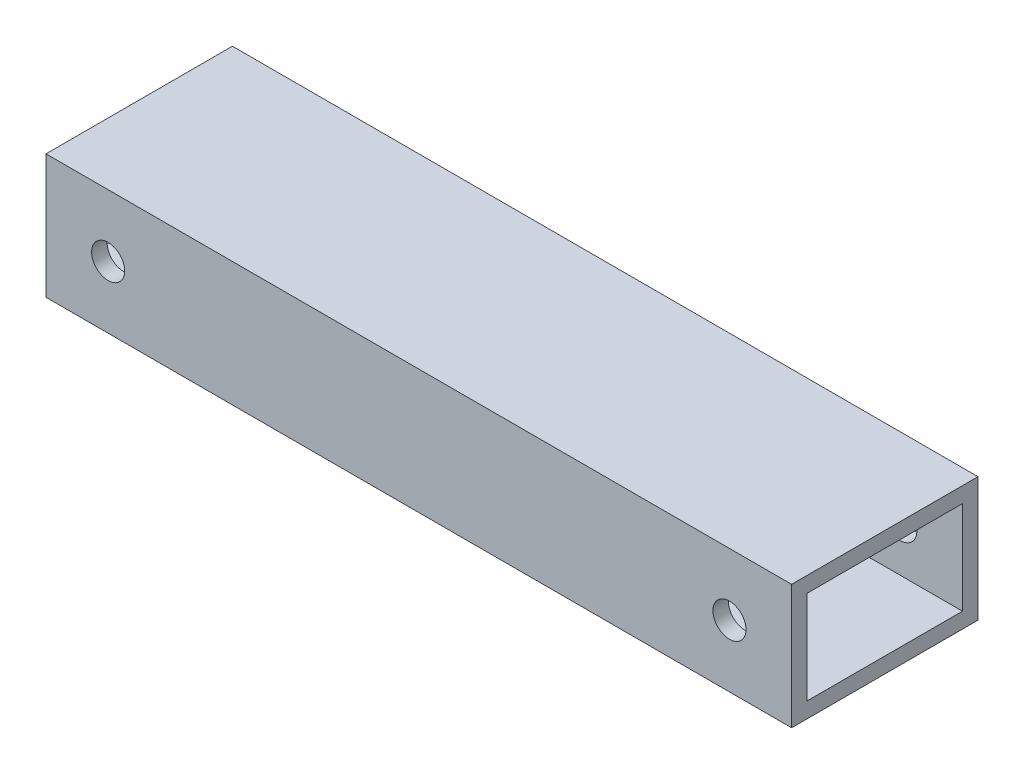
ISO-10303-21;
HEADER;
FILE_DESCRIPTION(('STEP AP214'),'2;1');
FILE_NAME('part.step','',(''),(''),'','','');
FILE_SCHEMA(('AUTOMOTIVE_DESIGN { 1 0 10303 214 1 1 1 1 }'));
ENDSEC;
DATA;
#1=APPLICATION_CONTEXT('core data for automotive mechanical design processes');
#2=APPLICATION_PROTOCOL_DEFINITION('international standard','automotive_design',2000,#1);
#3=PRODUCT_CONTEXT('',#1,'mechanical');
#4=PRODUCT('Part','Part','',(#3));
#5=PRODUCT_RELATED_PRODUCT_CATEGORY('part','',(#4));
#6=PRODUCT_DEFINITION_FORMATION('','',#4);
#7=PRODUCT_DEFINITION_CONTEXT('part definition',#1,'design');
#8=PRODUCT_DEFINITION('design','',#6,#7);
#9=PRODUCT_DEFINITION_SHAPE('','',#8);
#10=(LENGTH_UNIT() NAMED_UNIT(*) SI_UNIT(.MILLI.,.METRE.));
#11=(NAMED_UNIT(*) PLANE_ANGLE_UNIT() SI_UNIT($,.RADIAN.));
#12=(NAMED_UNIT(*) SI_UNIT($,.STERADIAN.) SOLID_ANGLE_UNIT());
#13=UNCERTAINTY_MEASURE_WITH_UNIT(LENGTH_MEASURE(1.E-05),#10,'distance_accuracy_value','');
#14=(GEOMETRIC_REPRESENTATION_CONTEXT(3) GLOBAL_UNCERTAINTY_ASSIGNED_CONTEXT((#13)) GLOBAL_UNIT_ASSIGNED_CONTEXT((#10,
#11,#12)) REPRESENTATION_CONTEXT('',''));
#15=CARTESIAN_POINT('',(0.,0.,0.));
#16=DIRECTION('',(0.,0.,1.));
#17=DIRECTION('',(1.,0.,0.));
#18=AXIS2_PLACEMENT_3D('',#15,#16,#17);
#19=CARTESIAN_POINT('',(152.4,0.,0.));
#20=DIRECTION('',(1.,0.,0.));
#21=DIRECTION('',(0.,0.,-1.));
#22=AXIS2_PLACEMENT_3D('',#19,#20,#21);
#23=PLANE('',#22);
#24=DIRECTION('',(0.,-1.,0.));
#25=VECTOR('',#24,1.);
#26=CARTESIAN_POINT('',(152.4,0.,0.));
#27=LINE('',#26,#25);
#28=CARTESIAN_POINT('',(152.4,25.4,0.));
#29=VERTEX_POINT('',#28);
#30=CARTESIAN_POINT('',(152.4,0.,0.));
#31=VERTEX_POINT('',#30);
#32=EDGE_CURVE('E162',#29,#31,#27,.T.);
#33=ORIENTED_EDGE('',*,*,#32,.T.);
#34=DIRECTION('',(0.,0.,-1.));
#35=VECTOR('',#34,1.);
#36=CARTESIAN_POINT('',(152.4,0.,0.));
#37=LINE('',#36,#35);
#38=CARTESIAN_POINT('',(152.4,0.,-38.1));
#39=VERTEX_POINT('',#38);
#40=EDGE_CURVE('E165',#31,#39,#37,.T.);
#41=ORIENTED_EDGE('',*,*,#40,.T.);
#42=DIRECTION('',(0.,1.,0.));
#43=VECTOR('',#42,1.);
#44=CARTESIAN_POINT('',(152.4,0.,-38.1));
#45=LINE('',#44,#43);
#46=CARTESIAN_POINT('',(152.4,25.4,-38.1));
#47=VERTEX_POINT('',#46);
#48=EDGE_CURVE('E168',#39,#47,#45,.T.);
#49=ORIENTED_EDGE('',*,*,#48,.T.);
#50=DIRECTION('',(0.,0.,1.));
#51=VECTOR('',#50,1.);
#52=CARTESIAN_POINT('',(152.4,25.4,0.));
#53=LINE('',#52,#51);
#54=EDGE_CURVE('E170',#47,#29,#53,.T.);
#55=ORIENTED_EDGE('',*,*,#54,.T.);
#56=EDGE_LOOP('',(#33,#41,#49,#55));
#57=FACE_BOUND('',#56,.T.);
#58=DIRECTION('',(0.,0.,-1.));
#59=VECTOR('',#58,1.);
#60=CARTESIAN_POINT('',(152.4,3.175,0.));
#61=LINE('',#60,#59);
#62=CARTESIAN_POINT('',(152.4,3.175,-3.175));
#63=VERTEX_POINT('',#62);
#64=CARTESIAN_POINT('',(152.4,3.175,-34.925));
#65=VERTEX_POINT('',#64);
#66=EDGE_CURVE('E132',#63,#65,#61,.T.);
#67=ORIENTED_EDGE('',*,*,#66,.F.);
#68=DIRECTION('',(0.,-1.,0.));
#69=VECTOR('',#68,1.);
#70=CARTESIAN_POINT('',(152.4,0.,-3.175));
#71=LINE('',#70,#69);
#72=CARTESIAN_POINT('',(152.4,22.225,-3.175));
#73=VERTEX_POINT('',#72);
#74=EDGE_CURVE('E124',#73,#63,#71,.T.);
#75=ORIENTED_EDGE('',*,*,#74,.F.);
#76=DIRECTION('',(0.,0.,1.));
#77=VECTOR('',#76,1.);
#78=CARTESIAN_POINT('',(152.4,22.225,0.));
#79=LINE('',#78,#77);
#80=CARTESIAN_POINT('',(152.4,22.225,-34.925));
#81=VERTEX_POINT('',#80);
#82=EDGE_CURVE('E146',#81,#73,#79,.T.);
#83=ORIENTED_EDGE('',*,*,#82,.F.);
#84=DIRECTION('',(0.,1.,0.));
#85=VECTOR('',#84,1.);
#86=CARTESIAN_POINT('',(152.4,0.,-34.925));
#87=LINE('',#86,#85);
#88=EDGE_CURVE('E144',#65,#81,#87,.T.);
#89=ORIENTED_EDGE('',*,*,#88,.F.);
#90=EDGE_LOOP('',(#67,#75,#83,#89));
#91=FACE_BOUND('',#90,.T.);
#92=ADVANCED_FACE('F57',(#57,#91),#23,.T.);
#93=CARTESIAN_POINT('',(0.,0.,0.));
#94=DIRECTION('',(1.,0.,0.));
#95=DIRECTION('',(0.,0.,-1.));
#96=AXIS2_PLACEMENT_3D('',#93,#94,#95);
#97=PLANE('',#96);
#98=DIRECTION('',(0.,-1.,0.));
#99=VECTOR('',#98,1.);
#100=CARTESIAN_POINT('',(0.,0.,0.));
#101=LINE('',#100,#99);
#102=CARTESIAN_POINT('',(0.,25.4,0.));
#103=VERTEX_POINT('',#102);
#104=CARTESIAN_POINT('',(0.,0.,0.));
#105=VERTEX_POINT('',#104);
#106=EDGE_CURVE('E140',#103,#105,#101,.T.);
#107=ORIENTED_EDGE('',*,*,#106,.F.);
#108=DIRECTION('',(0.,0.,1.));
#109=VECTOR('',#108,1.);
#110=CARTESIAN_POINT('',(0.,25.4,0.));
#111=LINE('',#110,#109);
#112=CARTESIAN_POINT('',(0.,25.4,-38.1));
#113=VERTEX_POINT('',#112);
#114=EDGE_CURVE('E166',#113,#103,#111,.T.);
#115=ORIENTED_EDGE('',*,*,#114,.F.);
#116=DIRECTION('',(0.,1.,0.));
#117=VECTOR('',#116,1.);
#118=CARTESIAN_POINT('',(0.,0.,-38.1));
#119=LINE('',#118,#117);
#120=CARTESIAN_POINT('',(0.,0.,-38.1));
#121=VERTEX_POINT('',#120);
#122=EDGE_CURVE('E177',#121,#113,#119,.T.);
#123=ORIENTED_EDGE('',*,*,#122,.F.);
#124=DIRECTION('',(0.,0.,-1.));
#125=VECTOR('',#124,1.);
#126=CARTESIAN_POINT('',(0.,0.,0.));
#127=LINE('',#126,#125);
#128=EDGE_CURVE('E175',#105,#121,#127,.T.);
#129=ORIENTED_EDGE('',*,*,#128,.F.);
#130=EDGE_LOOP('',(#107,#115,#123,#129));
#131=FACE_BOUND('',#130,.T.);
#132=DIRECTION('',(0.,-1.,0.));
#133=VECTOR('',#132,1.);
#134=CARTESIAN_POINT('',(0.,0.,-3.175));
#135=LINE('',#134,#133);
#136=CARTESIAN_POINT('',(0.,22.225,-3.175));
#137=VERTEX_POINT('',#136);
#138=CARTESIAN_POINT('',(0.,3.175,-3.175));
#139=VERTEX_POINT('',#138);
#140=EDGE_CURVE('E82',#137,#139,#135,.T.);
#141=ORIENTED_EDGE('',*,*,#140,.T.);
#142=DIRECTION('',(0.,0.,-1.));
#143=VECTOR('',#142,1.);
#144=CARTESIAN_POINT('',(0.,3.175,0.));
#145=LINE('',#144,#143);
#146=CARTESIAN_POINT('',(0.,3.175,-34.925));
#147=VERTEX_POINT('',#146);
#148=EDGE_CURVE('E139',#139,#147,#145,.T.);
#149=ORIENTED_EDGE('',*,*,#148,.T.);
#150=DIRECTION('',(0.,1.,0.));
#151=VECTOR('',#150,1.);
#152=CARTESIAN_POINT('',(0.,0.,-34.925));
#153=LINE('',#152,#151);
#154=CARTESIAN_POINT('',(0.,22.225,-34.925));
#155=VERTEX_POINT('',#154);
#156=EDGE_CURVE('E154',#147,#155,#153,.T.);
#157=ORIENTED_EDGE('',*,*,#156,.T.);
#158=DIRECTION('',(0.,0.,1.));
#159=VECTOR('',#158,1.);
#160=CARTESIAN_POINT('',(0.,22.225,0.));
#161=LINE('',#160,#159);
#162=EDGE_CURVE('E133',#155,#137,#161,.T.);
#163=ORIENTED_EDGE('',*,*,#162,.T.);
#164=EDGE_LOOP('',(#141,#149,#157,#163));
#165=FACE_BOUND('',#164,.T.);
#166=ADVANCED_FACE('F224',(#131,#165),#97,.F.);
#167=CARTESIAN_POINT('',(152.4,0.,0.));
#168=DIRECTION('',(0.,0.,-1.));
#169=DIRECTION('',(-1.,0.,0.));
#170=AXIS2_PLACEMENT_3D('',#167,#168,#169);
#171=PLANE('',#170);
#172=CARTESIAN_POINT('',(139.7,12.7,0.));
#173=DIRECTION('',(0.,0.,1.));
#174=DIRECTION('',(1.,0.,0.));
#175=AXIS2_PLACEMENT_3D('',#172,#173,#174);
#176=CIRCLE('',#175,3.37819999999999);
#177=CARTESIAN_POINT('',(143.0782,12.7,0.));
#178=VERTEX_POINT('',#177);
#179=EDGE_CURVE('E203',#178,#178,#176,.T.);
#180=ORIENTED_EDGE('',*,*,#179,.F.);
#181=EDGE_LOOP('',(#180));
#182=FACE_BOUND('',#181,.T.);
#183=CARTESIAN_POINT('',(12.7,12.7,0.));
#184=DIRECTION('',(0.,0.,1.));
#185=DIRECTION('',(1.,0.,0.));
#186=AXIS2_PLACEMENT_3D('',#183,#184,#185);
#187=CIRCLE('',#186,3.37819999999999);
#188=CARTESIAN_POINT('',(16.0782,12.7,0.));
#189=VERTEX_POINT('',#188);
#190=EDGE_CURVE('E193',#189,#189,#187,.T.);
#191=ORIENTED_EDGE('',*,*,#190,.F.);
#192=EDGE_LOOP('',(#191));
#193=FACE_BOUND('',#192,.T.);
#194=ORIENTED_EDGE('',*,*,#106,.T.);
#195=DIRECTION('',(-1.,0.,0.));
#196=VECTOR('',#195,1.);
#197=CARTESIAN_POINT('',(152.4,0.,0.));
#198=LINE('',#197,#196);
#199=EDGE_CURVE('E12',#31,#105,#198,.T.);
#200=ORIENTED_EDGE('',*,*,#199,.F.);
#201=ORIENTED_EDGE('',*,*,#32,.F.);
#202=DIRECTION('',(-1.,0.,0.));
#203=VECTOR('',#202,1.);
#204=CARTESIAN_POINT('',(152.4,25.4,0.));
#205=LINE('',#204,#203);
#206=EDGE_CURVE('E172',#29,#103,#205,.T.);
#207=ORIENTED_EDGE('',*,*,#206,.T.);
#208=EDGE_LOOP('',(#194,#200,#201,#207));
#209=FACE_BOUND('',#208,.T.);
#210=ADVANCED_FACE('F59',(#182,#193,#209),#171,.F.);
#211=CARTESIAN_POINT('',(152.4,0.,0.));
#212=DIRECTION('',(0.,1.,0.));
#213=DIRECTION('',(0.,0.,1.));
#214=AXIS2_PLACEMENT_3D('',#211,#212,#213);
#215=PLANE('',#214);
#216=ORIENTED_EDGE('',*,*,#128,.T.);
#217=DIRECTION('',(-1.,0.,0.));
#218=VECTOR('',#217,1.);
#219=CARTESIAN_POINT('',(152.4,0.,-38.1));
#220=LINE('',#219,#218);
#221=EDGE_CURVE('E66',#39,#121,#220,.T.);
#222=ORIENTED_EDGE('',*,*,#221,.F.);
#223=ORIENTED_EDGE('',*,*,#40,.F.);
#224=ORIENTED_EDGE('',*,*,#199,.T.);
#225=EDGE_LOOP('',(#216,#222,#223,#224));
#226=FACE_BOUND('',#225,.T.);
#227=ADVANCED_FACE('F250',(#226),#215,.F.);
#228=CARTESIAN_POINT('',(152.4,0.,-38.1));
#229=DIRECTION('',(0.,0.,1.));
#230=DIRECTION('',(1.,0.,0.));
#231=AXIS2_PLACEMENT_3D('',#228,#229,#230);
#232=PLANE('',#231);
#233=CARTESIAN_POINT('',(139.7,12.7,-38.1));
#234=DIRECTION('',(0.,0.,1.));
#235=DIRECTION('',(1.,0.,0.));
#236=AXIS2_PLACEMENT_3D('',#233,#234,#235);
#237=CIRCLE('',#236,3.37819999999999);
#238=CARTESIAN_POINT('',(143.0782,12.7,-38.1));
#239=VERTEX_POINT('',#238);
#240=EDGE_CURVE('E206',#239,#239,#237,.T.);
#241=ORIENTED_EDGE('',*,*,#240,.T.);
#242=EDGE_LOOP('',(#241));
#243=FACE_BOUND('',#242,.T.);
#244=CARTESIAN_POINT('',(12.7,12.7,-38.1));
#245=DIRECTION('',(0.,0.,1.));
#246=DIRECTION('',(1.,0.,0.));
#247=AXIS2_PLACEMENT_3D('',#244,#245,#246);
#248=CIRCLE('',#247,3.37819999999999);
#249=CARTESIAN_POINT('',(16.0782,12.7,-38.1));
#250=VERTEX_POINT('',#249);
#251=EDGE_CURVE('E188',#250,#250,#248,.T.);
#252=ORIENTED_EDGE('',*,*,#251,.T.);
#253=EDGE_LOOP('',(#252));
#254=FACE_BOUND('',#253,.T.);
#255=ORIENTED_EDGE('',*,*,#122,.T.);
#256=DIRECTION('',(-1.,0.,0.));
#257=VECTOR('',#256,1.);
#258=CARTESIAN_POINT('',(152.4,25.4,-38.1));
#259=LINE('',#258,#257);
#260=EDGE_CURVE('E182',#47,#113,#259,.T.);
#261=ORIENTED_EDGE('',*,*,#260,.F.);
#262=ORIENTED_EDGE('',*,*,#48,.F.);
#263=ORIENTED_EDGE('',*,*,#221,.T.);
#264=EDGE_LOOP('',(#255,#261,#262,#263));
#265=FACE_BOUND('',#264,.T.);
#266=ADVANCED_FACE('F247',(#243,#254,#265),#232,.F.);
#267=CARTESIAN_POINT('',(152.4,25.4,0.));
#268=DIRECTION('',(0.,-1.,0.));
#269=DIRECTION('',(0.,0.,-1.));
#270=AXIS2_PLACEMENT_3D('',#267,#268,#269);
#271=PLANE('',#270);
#272=ORIENTED_EDGE('',*,*,#114,.T.);
#273=ORIENTED_EDGE('',*,*,#206,.F.);
#274=ORIENTED_EDGE('',*,*,#54,.F.);
#275=ORIENTED_EDGE('',*,*,#260,.T.);
#276=EDGE_LOOP('',(#272,#273,#274,#275));
#277=FACE_BOUND('',#276,.T.);
#278=ADVANCED_FACE('F244',(#277),#271,.F.);
#279=CARTESIAN_POINT('',(152.4,0.,-3.175));
#280=DIRECTION('',(0.,0.,-1.));
#281=DIRECTION('',(-1.,0.,0.));
#282=AXIS2_PLACEMENT_3D('',#279,#280,#281);
#283=PLANE('',#282);
#284=CARTESIAN_POINT('',(139.7,12.7,-3.175));
#285=DIRECTION('',(0.,0.,-1.));
#286=DIRECTION('',(-1.,0.,0.));
#287=AXIS2_PLACEMENT_3D('',#284,#285,#286);
#288=CIRCLE('',#287,3.37819999999999);
#289=CARTESIAN_POINT('',(143.0782,12.7,-3.175));
#290=VERTEX_POINT('',#289);
#291=EDGE_CURVE('E198',#290,#290,#288,.T.);
#292=ORIENTED_EDGE('',*,*,#291,.F.);
#293=EDGE_LOOP('',(#292));
#294=FACE_BOUND('',#293,.T.);
#295=CARTESIAN_POINT('',(12.7,12.7,-3.175));
#296=DIRECTION('',(0.,0.,-1.));
#297=DIRECTION('',(-1.,0.,0.));
#298=AXIS2_PLACEMENT_3D('',#295,#296,#297);
#299=CIRCLE('',#298,3.37819999999999);
#300=CARTESIAN_POINT('',(16.0782,12.7,-3.175));
#301=VERTEX_POINT('',#300);
#302=EDGE_CURVE('E152',#301,#301,#299,.T.);
#303=ORIENTED_EDGE('',*,*,#302,.F.);
#304=EDGE_LOOP('',(#303));
#305=FACE_BOUND('',#304,.T.);
#306=ORIENTED_EDGE('',*,*,#140,.F.);
#307=DIRECTION('',(-1.,0.,0.));
#308=VECTOR('',#307,1.);
#309=CARTESIAN_POINT('',(152.4,22.225,-3.175));
#310=LINE('',#309,#308);
#311=EDGE_CURVE('E128',#73,#137,#310,.T.);
#312=ORIENTED_EDGE('',*,*,#311,.F.);
#313=ORIENTED_EDGE('',*,*,#74,.T.);
#314=DIRECTION('',(-1.,0.,0.));
#315=VECTOR('',#314,1.);
#316=CARTESIAN_POINT('',(152.4,3.175,-3.175));
#317=LINE('',#316,#315);
#318=EDGE_CURVE('E127',#63,#139,#317,.T.);
#319=ORIENTED_EDGE('',*,*,#318,.T.);
#320=EDGE_LOOP('',(#306,#312,#313,#319));
#321=FACE_BOUND('',#320,.T.);
#322=ADVANCED_FACE('F126',(#294,#305,#321),#283,.T.);
#323=CARTESIAN_POINT('',(152.4,3.175,0.));
#324=DIRECTION('',(0.,1.,0.));
#325=DIRECTION('',(0.,0.,1.));
#326=AXIS2_PLACEMENT_3D('',#323,#324,#325);
#327=PLANE('',#326);
#328=ORIENTED_EDGE('',*,*,#148,.F.);
#329=ORIENTED_EDGE('',*,*,#318,.F.);
#330=ORIENTED_EDGE('',*,*,#66,.T.);
#331=DIRECTION('',(-1.,0.,0.));
#332=VECTOR('',#331,1.);
#333=CARTESIAN_POINT('',(152.4,3.175,-34.925));
#334=LINE('',#333,#332);
#335=EDGE_CURVE('E141',#65,#147,#334,.T.);
#336=ORIENTED_EDGE('',*,*,#335,.T.);
#337=EDGE_LOOP('',(#328,#329,#330,#336));
#338=FACE_BOUND('',#337,.T.);
#339=ADVANCED_FACE('F136',(#338),#327,.T.);
#340=CARTESIAN_POINT('',(152.4,0.,-34.925));
#341=DIRECTION('',(0.,0.,1.));
#342=DIRECTION('',(1.,0.,0.));
#343=AXIS2_PLACEMENT_3D('',#340,#341,#342);
#344=PLANE('',#343);
#345=CARTESIAN_POINT('',(139.7,12.7,-34.925));
#346=DIRECTION('',(0.,0.,1.));
#347=DIRECTION('',(1.,0.,0.));
#348=AXIS2_PLACEMENT_3D('',#345,#346,#347);
#349=CIRCLE('',#348,3.37819999999999);
#350=CARTESIAN_POINT('',(143.0782,12.7,-34.925));
#351=VERTEX_POINT('',#350);
#352=EDGE_CURVE('E61',#351,#351,#349,.T.);
#353=ORIENTED_EDGE('',*,*,#352,.F.);
#354=EDGE_LOOP('',(#353));
#355=FACE_BOUND('',#354,.T.);
#356=CARTESIAN_POINT('',(12.7,12.7,-34.925));
#357=DIRECTION('',(0.,0.,1.));
#358=DIRECTION('',(1.,0.,0.));
#359=AXIS2_PLACEMENT_3D('',#356,#357,#358);
#360=CIRCLE('',#359,3.37819999999999);
#361=CARTESIAN_POINT('',(16.0782,12.7,-34.925));
#362=VERTEX_POINT('',#361);
#363=EDGE_CURVE('E186',#362,#362,#360,.T.);
#364=ORIENTED_EDGE('',*,*,#363,.F.);
#365=EDGE_LOOP('',(#364));
#366=FACE_BOUND('',#365,.T.);
#367=ORIENTED_EDGE('',*,*,#156,.F.);
#368=ORIENTED_EDGE('',*,*,#335,.F.);
#369=ORIENTED_EDGE('',*,*,#88,.T.);
#370=DIRECTION('',(-1.,0.,0.));
#371=VECTOR('',#370,1.);
#372=CARTESIAN_POINT('',(152.4,22.225,-34.925));
#373=LINE('',#372,#371);
#374=EDGE_CURVE('E74',#81,#155,#373,.T.);
#375=ORIENTED_EDGE('',*,*,#374,.T.);
#376=EDGE_LOOP('',(#367,#368,#369,#375));
#377=FACE_BOUND('',#376,.T.);
#378=ADVANCED_FACE('F216',(#355,#366,#377),#344,.T.);
#379=CARTESIAN_POINT('',(152.4,22.225,0.));
#380=DIRECTION('',(0.,-1.,0.));
#381=DIRECTION('',(0.,0.,-1.));
#382=AXIS2_PLACEMENT_3D('',#379,#380,#381);
#383=PLANE('',#382);
#384=ORIENTED_EDGE('',*,*,#162,.F.);
#385=ORIENTED_EDGE('',*,*,#374,.F.);
#386=ORIENTED_EDGE('',*,*,#82,.T.);
#387=ORIENTED_EDGE('',*,*,#311,.T.);
#388=EDGE_LOOP('',(#384,#385,#386,#387));
#389=FACE_BOUND('',#388,.T.);
#390=ADVANCED_FACE('F219',(#389),#383,.T.);
#391=CARTESIAN_POINT('',(12.7,12.7,-38.1));
#392=DIRECTION('',(0.,0.,1.));
#393=DIRECTION('',(1.,0.,0.));
#394=AXIS2_PLACEMENT_3D('',#391,#392,#393);
#395=CYLINDRICAL_SURFACE('',#394,3.37819999999999);
#396=CARTESIAN_POINT('',(16.0782,12.7,-34.925));
#397=CARTESIAN_POINT('',(16.0782,12.7,-34.9580729166667));
#398=CARTESIAN_POINT('',(16.0782,12.7,-34.9911458333333));
#399=CARTESIAN_POINT('',(16.0782,12.7,-35.0572916666667));
#400=CARTESIAN_POINT('',(16.0782,12.7,-35.0903645833333));
#401=CARTESIAN_POINT('',(16.0782,12.7,-35.1565104166667));
#402=CARTESIAN_POINT('',(16.0782,12.7,-35.1895833333333));
#403=CARTESIAN_POINT('',(16.0782,12.7,-35.2557291666667));
#404=CARTESIAN_POINT('',(16.0782,12.7,-35.2888020833333));
#405=CARTESIAN_POINT('',(16.0782,12.7,-35.3549479166667));
#406=CARTESIAN_POINT('',(16.0782,12.7,-35.3880208333333));
#407=CARTESIAN_POINT('',(16.0782,12.7,-35.4541666666667));
#408=CARTESIAN_POINT('',(16.0782,12.7,-35.4872395833333));
#409=CARTESIAN_POINT('',(16.0782,12.7,-35.5533854166667));
#410=CARTESIAN_POINT('',(16.0782,12.7,-35.5864583333333));
#411=CARTESIAN_POINT('',(16.0782,12.7,-35.6526041666667));
#412=CARTESIAN_POINT('',(16.0782,12.7,-35.6856770833333));
#413=CARTESIAN_POINT('',(16.0782,12.7,-35.7518229166667));
#414=CARTESIAN_POINT('',(16.0782,12.7,-35.7848958333333));
#415=CARTESIAN_POINT('',(16.0782,12.7,-35.8510416666667));
#416=CARTESIAN_POINT('',(16.0782,12.7,-35.8841145833333));
#417=CARTESIAN_POINT('',(16.0782,12.7,-35.9502604166667));
#418=CARTESIAN_POINT('',(16.0782,12.7,-35.9833333333333));
#419=CARTESIAN_POINT('',(16.0782,12.7,-36.0494791666667));
#420=CARTESIAN_POINT('',(16.0782,12.7,-36.0825520833333));
#421=CARTESIAN_POINT('',(16.0782,12.7,-36.1486979166667));
#422=CARTESIAN_POINT('',(16.0782,12.7,-36.1817708333333));
#423=CARTESIAN_POINT('',(16.0782,12.7,-36.2479166666667));
#424=CARTESIAN_POINT('',(16.0782,12.7,-36.2809895833333));
#425=CARTESIAN_POINT('',(16.0782,12.7,-36.3471354166667));
#426=CARTESIAN_POINT('',(16.0782,12.7,-36.3802083333333));
#427=CARTESIAN_POINT('',(16.0782,12.7,-36.4463541666667));
#428=CARTESIAN_POINT('',(16.0782,12.7,-36.4794270833333));
#429=CARTESIAN_POINT('',(16.0782,12.7,-36.5455729166667));
#430=CARTESIAN_POINT('',(16.0782,12.7,-36.5786458333333));
#431=CARTESIAN_POINT('',(16.0782,12.7,-36.6447916666667));
#432=CARTESIAN_POINT('',(16.0782,12.7,-36.6778645833333));
#433=CARTESIAN_POINT('',(16.0782,12.7,-36.7440104166667));
#434=CARTESIAN_POINT('',(16.0782,12.7,-36.7770833333333));
#435=CARTESIAN_POINT('',(16.0782,12.7,-36.8432291666667));
#436=CARTESIAN_POINT('',(16.0782,12.7,-36.8763020833333));
#437=CARTESIAN_POINT('',(16.0782,12.7,-36.9424479166667));
#438=CARTESIAN_POINT('',(16.0782,12.7,-36.9755208333333));
#439=CARTESIAN_POINT('',(16.0782,12.7,-37.0416666666667));
#440=CARTESIAN_POINT('',(16.0782,12.7,-37.0747395833333));
#441=CARTESIAN_POINT('',(16.0782,12.7,-37.1408854166667));
#442=CARTESIAN_POINT('',(16.0782,12.7,-37.1739583333333));
#443=CARTESIAN_POINT('',(16.0782,12.7,-37.2401041666667));
#444=CARTESIAN_POINT('',(16.0782,12.7,-37.2731770833333));
#445=CARTESIAN_POINT('',(16.0782,12.7,-37.3393229166667));
#446=CARTESIAN_POINT('',(16.0782,12.7,-37.3723958333333));
#447=CARTESIAN_POINT('',(16.0782,12.7,-37.4385416666667));
#448=CARTESIAN_POINT('',(16.0782,12.7,-37.4716145833333));
#449=CARTESIAN_POINT('',(16.0782,12.7,-37.5377604166667));
#450=CARTESIAN_POINT('',(16.0782,12.7,-37.5708333333333));
#451=CARTESIAN_POINT('',(16.0782,12.7,-37.6369791666667));
#452=CARTESIAN_POINT('',(16.0782,12.7,-37.6700520833333));
#453=CARTESIAN_POINT('',(16.0782,12.7,-37.7361979166667));
#454=CARTESIAN_POINT('',(16.0782,12.7,-37.7692708333333));
#455=CARTESIAN_POINT('',(16.0782,12.7,-37.8354166666667));
#456=CARTESIAN_POINT('',(16.0782,12.7,-37.8684895833333));
#457=CARTESIAN_POINT('',(16.0782,12.7,-37.9346354166667));
#458=CARTESIAN_POINT('',(16.0782,12.7,-37.9677083333333));
#459=CARTESIAN_POINT('',(16.0782,12.7,-38.0338541666667));
#460=CARTESIAN_POINT('',(16.0782,12.7,-38.0669270833333));
#461=CARTESIAN_POINT('',(16.0782,12.7,-38.1));
#462=B_SPLINE_CURVE_WITH_KNOTS('',3,(#396,#397,#398,#399,#400,#401,#402,#403,#404,#405,#406,
#407,#408,#409,#410,#411,#412,#413,#414,#415,#416,#417,#418,#419,#420,#421,#422,#423,#424,#425,
#426,#427,#428,#429,#430,#431,#432,#433,#434,#435,#436,#437,#438,#439,#440,#441,#442,#443,#444,
#445,#446,#447,#448,#449,#450,#451,#452,#453,#454,#455,#456,#457,#458,#459,#460,#461),
.UNSPECIFIED.,.F.,.F.,(4,2,2,2,2,2,2,2,2,2,2,2,2,2,2,2,2,2,2,2,2,2,2,2,2,2,2,2,2,2,2,2,4),(0.,
0.0992187500000047,0.198437500000002,0.29765625,0.396875000000005,0.496093750000003,0.5953125,
0.694531250000005,0.793750000000003,0.892968750000001,0.992187500000005,1.09140625,1.190625,
1.28984375000001,1.3890625,1.48828125,1.5875,1.68671875,1.7859375,1.88515625,1.984375,
2.08359375,2.1828125,2.28203125,2.38125,2.48046875,2.5796875,2.67890625,2.778125,2.87734375,
2.9765625,3.07578125,3.175),.UNSPECIFIED.);
#463=EDGE_CURVE('BSEAM226',#362,#250,#462,.T.);
#464=ORIENTED_EDGE('',*,*,#363,.T.);
#465=ORIENTED_EDGE('',*,*,#251,.F.);
#466=ORIENTED_EDGE('',*,*,#463,.T.);
#467=ORIENTED_EDGE('',*,*,#463,.F.);
#468=EDGE_LOOP('',(#464,#466,#465,#467));
#469=FACE_BOUND('',#468,.T.);
#470=ADVANCED_FACE('F226',(#469),#395,.F.);
#471=CARTESIAN_POINT('',(16.0782,12.7,-3.175));
#472=CARTESIAN_POINT('',(16.0782,12.7,-3.14192708333333));
#473=CARTESIAN_POINT('',(16.0782,12.7,-3.10885416666667));
#474=CARTESIAN_POINT('',(16.0782,12.7,-3.04270833333333));
#475=CARTESIAN_POINT('',(16.0782,12.7,-3.00963541666666));
#476=CARTESIAN_POINT('',(16.0782,12.7,-2.94348958333333));
#477=CARTESIAN_POINT('',(16.0782,12.7,-2.91041666666666));
#478=CARTESIAN_POINT('',(16.0782,12.7,-2.84427083333333));
#479=CARTESIAN_POINT('',(16.0782,12.7,-2.81119791666667));
#480=CARTESIAN_POINT('',(16.0782,12.7,-2.74505208333333));
#481=CARTESIAN_POINT('',(16.0782,12.7,-2.71197916666666));
#482=CARTESIAN_POINT('',(16.0782,12.7,-2.64583333333333));
#483=CARTESIAN_POINT('',(16.0782,12.7,-2.61276041666666));
#484=CARTESIAN_POINT('',(16.0782,12.7,-2.54661458333333));
#485=CARTESIAN_POINT('',(16.0782,12.7,-2.51354166666667));
#486=CARTESIAN_POINT('',(16.0782,12.7,-2.44739583333333));
#487=CARTESIAN_POINT('',(16.0782,12.7,-2.41432291666667));
#488=CARTESIAN_POINT('',(16.0782,12.7,-2.34817708333333));
#489=CARTESIAN_POINT('',(16.0782,12.7,-2.31510416666667));
#490=CARTESIAN_POINT('',(16.0782,12.7,-2.24895833333333));
#491=CARTESIAN_POINT('',(16.0782,12.7,-2.21588541666666));
#492=CARTESIAN_POINT('',(16.0782,12.7,-2.14973958333333));
#493=CARTESIAN_POINT('',(16.0782,12.7,-2.11666666666667));
#494=CARTESIAN_POINT('',(16.0782,12.7,-2.05052083333333));
#495=CARTESIAN_POINT('',(16.0782,12.7,-2.01744791666667));
#496=CARTESIAN_POINT('',(16.0782,12.7,-1.95130208333333));
#497=CARTESIAN_POINT('',(16.0782,12.7,-1.91822916666666));
#498=CARTESIAN_POINT('',(16.0782,12.7,-1.85208333333333));
#499=CARTESIAN_POINT('',(16.0782,12.7,-1.81901041666667));
#500=CARTESIAN_POINT('',(16.0782,12.7,-1.75286458333333));
#501=CARTESIAN_POINT('',(16.0782,12.7,-1.71979166666666));
#502=CARTESIAN_POINT('',(16.0782,12.7,-1.65364583333333));
#503=CARTESIAN_POINT('',(16.0782,12.7,-1.62057291666666));
#504=CARTESIAN_POINT('',(16.0782,12.7,-1.55442708333333));
#505=CARTESIAN_POINT('',(16.0782,12.7,-1.52135416666667));
#506=CARTESIAN_POINT('',(16.0782,12.7,-1.45520833333333));
#507=CARTESIAN_POINT('',(16.0782,12.7,-1.42213541666666));
#508=CARTESIAN_POINT('',(16.0782,12.7,-1.35598958333333));
#509=CARTESIAN_POINT('',(16.0782,12.7,-1.32291666666666));
#510=CARTESIAN_POINT('',(16.0782,12.7,-1.25677083333333));
#511=CARTESIAN_POINT('',(16.0782,12.7,-1.22369791666667));
#512=CARTESIAN_POINT('',(16.0782,12.7,-1.15755208333333));
#513=CARTESIAN_POINT('',(16.0782,12.7,-1.12447916666666));
#514=CARTESIAN_POINT('',(16.0782,12.7,-1.05833333333333));
#515=CARTESIAN_POINT('',(16.0782,12.7,-1.02526041666666));
#516=CARTESIAN_POINT('',(16.0782,12.7,-0.959114583333332));
#517=CARTESIAN_POINT('',(16.0782,12.7,-0.926041666666666));
#518=CARTESIAN_POINT('',(16.0782,12.7,-0.859895833333332));
#519=CARTESIAN_POINT('',(16.0782,12.7,-0.826822916666664));
#520=CARTESIAN_POINT('',(16.0782,12.7,-0.76067708333333));
#521=CARTESIAN_POINT('',(16.0782,12.7,-0.727604166666664));
#522=CARTESIAN_POINT('',(16.0782,12.7,-0.661458333333332));
#523=CARTESIAN_POINT('',(16.0782,12.7,-0.628385416666666));
#524=CARTESIAN_POINT('',(16.0782,12.7,-0.562239583333334));
#525=CARTESIAN_POINT('',(16.0782,12.7,-0.529166666666669));
#526=CARTESIAN_POINT('',(16.0782,12.7,-0.463020833333334));
#527=CARTESIAN_POINT('',(16.0782,12.7,-0.429947916666666));
#528=CARTESIAN_POINT('',(16.0782,12.7,-0.363802083333332));
#529=CARTESIAN_POINT('',(16.0782,12.7,-0.330729166666666));
#530=CARTESIAN_POINT('',(16.0782,12.7,-0.264583333333334));
#531=CARTESIAN_POINT('',(16.0782,12.7,-0.231510416666668));
#532=CARTESIAN_POINT('',(16.0782,12.7,-0.165364583333334));
#533=CARTESIAN_POINT('',(16.0782,12.7,-0.132291666666666));
#534=CARTESIAN_POINT('',(16.0782,12.7,-0.0661458333333318));
#535=CARTESIAN_POINT('',(16.0782,12.7,-0.0330729166666659));
#536=CARTESIAN_POINT('',(16.0782,12.7,0.));
#537=B_SPLINE_CURVE_WITH_KNOTS('',3,(#471,#472,#473,#474,#475,#476,#477,#478,#479,#480,#481,
#482,#483,#484,#485,#486,#487,#488,#489,#490,#491,#492,#493,#494,#495,#496,#497,#498,#499,#500,
#501,#502,#503,#504,#505,#506,#507,#508,#509,#510,#511,#512,#513,#514,#515,#516,#517,#518,#519,
#520,#521,#522,#523,#524,#525,#526,#527,#528,#529,#530,#531,#532,#533,#534,#535,#536),
.UNSPECIFIED.,.F.,.F.,(4,2,2,2,2,2,2,2,2,2,2,2,2,2,2,2,2,2,2,2,2,2,2,2,2,2,2,2,2,2,2,2,4),(0.,
0.0992187499999977,0.198437500000002,0.29765625,0.396874999999998,0.496093750000003,0.5953125,
0.694531249999998,0.793749999999996,0.892968750000001,0.992187499999998,1.09140625,1.190625,
1.28984375,1.3890625,1.48828125,1.5875,1.68671875,1.7859375,1.88515625,1.984375,2.08359375,
2.1828125,2.28203125,2.38125,2.48046875,2.5796875,2.67890624999999,2.778125,2.87734375,
2.97656249999999,3.07578125,3.175),.UNSPECIFIED.);
#538=EDGE_CURVE('BSEAM231',#301,#189,#537,.T.);
#539=ORIENTED_EDGE('',*,*,#302,.T.);
#540=ORIENTED_EDGE('',*,*,#190,.T.);
#541=ORIENTED_EDGE('',*,*,#538,.T.);
#542=ORIENTED_EDGE('',*,*,#538,.F.);
#543=EDGE_LOOP('',(#539,#541,#540,#542));
#544=FACE_BOUND('',#543,.T.);
#545=ADVANCED_FACE('F231',(#544),#395,.F.);
#546=CARTESIAN_POINT('',(139.7,12.7,-38.1));
#547=DIRECTION('',(0.,0.,1.));
#548=DIRECTION('',(1.,0.,0.));
#549=AXIS2_PLACEMENT_3D('',#546,#547,#548);
#550=CYLINDRICAL_SURFACE('',#549,3.37819999999999);
#551=CARTESIAN_POINT('',(143.0782,12.7,-34.925));
#552=CARTESIAN_POINT('',(143.0782,12.7,-34.9580729166667));
#553=CARTESIAN_POINT('',(143.0782,12.7,-34.9911458333333));
#554=CARTESIAN_POINT('',(143.0782,12.7,-35.0572916666667));
#555=CARTESIAN_POINT('',(143.0782,12.7,-35.0903645833333));
#556=CARTESIAN_POINT('',(143.0782,12.7,-35.1565104166667));
#557=CARTESIAN_POINT('',(143.0782,12.7,-35.1895833333333));
#558=CARTESIAN_POINT('',(143.0782,12.7,-35.2557291666667));
#559=CARTESIAN_POINT('',(143.0782,12.7,-35.2888020833333));
#560=CARTESIAN_POINT('',(143.0782,12.7,-35.3549479166667));
#561=CARTESIAN_POINT('',(143.0782,12.7,-35.3880208333333));
#562=CARTESIAN_POINT('',(143.0782,12.7,-35.4541666666667));
#563=CARTESIAN_POINT('',(143.0782,12.7,-35.4872395833333));
#564=CARTESIAN_POINT('',(143.0782,12.7,-35.5533854166667));
#565=CARTESIAN_POINT('',(143.0782,12.7,-35.5864583333333));
#566=CARTESIAN_POINT('',(143.0782,12.7,-35.6526041666667));
#567=CARTESIAN_POINT('',(143.0782,12.7,-35.6856770833333));
#568=CARTESIAN_POINT('',(143.0782,12.7,-35.7518229166667));
#569=CARTESIAN_POINT('',(143.0782,12.7,-35.7848958333333));
#570=CARTESIAN_POINT('',(143.0782,12.7,-35.8510416666667));
#571=CARTESIAN_POINT('',(143.0782,12.7,-35.8841145833333));
#572=CARTESIAN_POINT('',(143.0782,12.7,-35.9502604166667));
#573=CARTESIAN_POINT('',(143.0782,12.7,-35.9833333333333));
#574=CARTESIAN_POINT('',(143.0782,12.7,-36.0494791666667));
#575=CARTESIAN_POINT('',(143.0782,12.7,-36.0825520833333));
#576=CARTESIAN_POINT('',(143.0782,12.7,-36.1486979166667));
#577=CARTESIAN_POINT('',(143.0782,12.7,-36.1817708333333));
#578=CARTESIAN_POINT('',(143.0782,12.7,-36.2479166666667));
#579=CARTESIAN_POINT('',(143.0782,12.7,-36.2809895833333));
#580=CARTESIAN_POINT('',(143.0782,12.7,-36.3471354166667));
#581=CARTESIAN_POINT('',(143.0782,12.7,-36.3802083333333));
#582=CARTESIAN_POINT('',(143.0782,12.7,-36.4463541666667));
#583=CARTESIAN_POINT('',(143.0782,12.7,-36.4794270833333));
#584=CARTESIAN_POINT('',(143.0782,12.7,-36.5455729166667));
#585=CARTESIAN_POINT('',(143.0782,12.7,-36.5786458333333));
#586=CARTESIAN_POINT('',(143.0782,12.7,-36.6447916666667));
#587=CARTESIAN_POINT('',(143.0782,12.7,-36.6778645833333));
#588=CARTESIAN_POINT('',(143.0782,12.7,-36.7440104166667));
#589=CARTESIAN_POINT('',(143.0782,12.7,-36.7770833333333));
#590=CARTESIAN_POINT('',(143.0782,12.7,-36.8432291666667));
#591=CARTESIAN_POINT('',(143.0782,12.7,-36.8763020833333));
#592=CARTESIAN_POINT('',(143.0782,12.7,-36.9424479166667));
#593=CARTESIAN_POINT('',(143.0782,12.7,-36.9755208333333));
#594=CARTESIAN_POINT('',(143.0782,12.7,-37.0416666666667));
#595=CARTESIAN_POINT('',(143.0782,12.7,-37.0747395833333));
#596=CARTESIAN_POINT('',(143.0782,12.7,-37.1408854166667));
#597=CARTESIAN_POINT('',(143.0782,12.7,-37.1739583333333));
#598=CARTESIAN_POINT('',(143.0782,12.7,-37.2401041666667));
#599=CARTESIAN_POINT('',(143.0782,12.7,-37.2731770833333));
#600=CARTESIAN_POINT('',(143.0782,12.7,-37.3393229166667));
#601=CARTESIAN_POINT('',(143.0782,12.7,-37.3723958333333));
#602=CARTESIAN_POINT('',(143.0782,12.7,-37.4385416666667));
#603=CARTESIAN_POINT('',(143.0782,12.7,-37.4716145833333));
#604=CARTESIAN_POINT('',(143.0782,12.7,-37.5377604166667));
#605=CARTESIAN_POINT('',(143.0782,12.7,-37.5708333333333));
#606=CARTESIAN_POINT('',(143.0782,12.7,-37.6369791666667));
#607=CARTESIAN_POINT('',(143.0782,12.7,-37.6700520833333));
#608=CARTESIAN_POINT('',(143.0782,12.7,-37.7361979166667));
#609=CARTESIAN_POINT('',(143.0782,12.7,-37.7692708333333));
#610=CARTESIAN_POINT('',(143.0782,12.7,-37.8354166666667));
#611=CARTESIAN_POINT('',(143.0782,12.7,-37.8684895833333));
#612=CARTESIAN_POINT('',(143.0782,12.7,-37.9346354166667));
#613=CARTESIAN_POINT('',(143.0782,12.7,-37.9677083333333));
#614=CARTESIAN_POINT('',(143.0782,12.7,-38.0338541666667));
#615=CARTESIAN_POINT('',(143.0782,12.7,-38.0669270833333));
#616=CARTESIAN_POINT('',(143.0782,12.7,-38.1));
#617=B_SPLINE_CURVE_WITH_KNOTS('',3,(#551,#552,#553,#554,#555,#556,#557,#558,#559,#560,#561,
#562,#563,#564,#565,#566,#567,#568,#569,#570,#571,#572,#573,#574,#575,#576,#577,#578,#579,#580,
#581,#582,#583,#584,#585,#586,#587,#588,#589,#590,#591,#592,#593,#594,#595,#596,#597,#598,#599,
#600,#601,#602,#603,#604,#605,#606,#607,#608,#609,#610,#611,#612,#613,#614,#615,#616),
.UNSPECIFIED.,.F.,.F.,(4,2,2,2,2,2,2,2,2,2,2,2,2,2,2,2,2,2,2,2,2,2,2,2,2,2,2,2,2,2,2,2,4),(0.,
0.0992187500000047,0.198437500000002,0.29765625,0.396875000000005,0.496093750000003,0.5953125,
0.694531250000005,0.793750000000003,0.892968750000001,0.992187500000005,1.09140625,1.190625,
1.28984375000001,1.3890625,1.48828125,1.5875,1.68671875,1.7859375,1.88515625,1.984375,
2.08359375,2.1828125,2.28203125,2.38125,2.48046875,2.5796875,2.67890625,2.778125,2.87734375,
2.9765625,3.07578125,3.175),.UNSPECIFIED.);
#618=EDGE_CURVE('BSEAM213',#351,#239,#617,.T.);
#619=ORIENTED_EDGE('',*,*,#352,.T.);
#620=ORIENTED_EDGE('',*,*,#240,.F.);
#621=ORIENTED_EDGE('',*,*,#618,.T.);
#622=ORIENTED_EDGE('',*,*,#618,.F.);
#623=EDGE_LOOP('',(#619,#621,#620,#622));
#624=FACE_BOUND('',#623,.T.);
#625=ADVANCED_FACE('F213',(#624),#550,.F.);
#626=CARTESIAN_POINT('',(143.0782,12.7,-3.175));
#627=CARTESIAN_POINT('',(143.0782,12.7,-3.14192708333333));
#628=CARTESIAN_POINT('',(143.0782,12.7,-3.10885416666667));
#629=CARTESIAN_POINT('',(143.0782,12.7,-3.04270833333333));
#630=CARTESIAN_POINT('',(143.0782,12.7,-3.00963541666666));
#631=CARTESIAN_POINT('',(143.0782,12.7,-2.94348958333333));
#632=CARTESIAN_POINT('',(143.0782,12.7,-2.91041666666666));
#633=CARTESIAN_POINT('',(143.0782,12.7,-2.84427083333333));
#634=CARTESIAN_POINT('',(143.0782,12.7,-2.81119791666667));
#635=CARTESIAN_POINT('',(143.0782,12.7,-2.74505208333333));
#636=CARTESIAN_POINT('',(143.0782,12.7,-2.71197916666666));
#637=CARTESIAN_POINT('',(143.0782,12.7,-2.64583333333333));
#638=CARTESIAN_POINT('',(143.0782,12.7,-2.61276041666666));
#639=CARTESIAN_POINT('',(143.0782,12.7,-2.54661458333333));
#640=CARTESIAN_POINT('',(143.0782,12.7,-2.51354166666667));
#641=CARTESIAN_POINT('',(143.0782,12.7,-2.44739583333333));
#642=CARTESIAN_POINT('',(143.0782,12.7,-2.41432291666667));
#643=CARTESIAN_POINT('',(143.0782,12.7,-2.34817708333333));
#644=CARTESIAN_POINT('',(143.0782,12.7,-2.31510416666667));
#645=CARTESIAN_POINT('',(143.0782,12.7,-2.24895833333333));
#646=CARTESIAN_POINT('',(143.0782,12.7,-2.21588541666666));
#647=CARTESIAN_POINT('',(143.0782,12.7,-2.14973958333333));
#648=CARTESIAN_POINT('',(143.0782,12.7,-2.11666666666667));
#649=CARTESIAN_POINT('',(143.0782,12.7,-2.05052083333333));
#650=CARTESIAN_POINT('',(143.0782,12.7,-2.01744791666667));
#651=CARTESIAN_POINT('',(143.0782,12.7,-1.95130208333333));
#652=CARTESIAN_POINT('',(143.0782,12.7,-1.91822916666666));
#653=CARTESIAN_POINT('',(143.0782,12.7,-1.85208333333333));
#654=CARTESIAN_POINT('',(143.0782,12.7,-1.81901041666667));
#655=CARTESIAN_POINT('',(143.0782,12.7,-1.75286458333333));
#656=CARTESIAN_POINT('',(143.0782,12.7,-1.71979166666666));
#657=CARTESIAN_POINT('',(143.0782,12.7,-1.65364583333333));
#658=CARTESIAN_POINT('',(143.0782,12.7,-1.62057291666666));
#659=CARTESIAN_POINT('',(143.0782,12.7,-1.55442708333333));
#660=CARTESIAN_POINT('',(143.0782,12.7,-1.52135416666667));
#661=CARTESIAN_POINT('',(143.0782,12.7,-1.45520833333333));
#662=CARTESIAN_POINT('',(143.0782,12.7,-1.42213541666666));
#663=CARTESIAN_POINT('',(143.0782,12.7,-1.35598958333333));
#664=CARTESIAN_POINT('',(143.0782,12.7,-1.32291666666666));
#665=CARTESIAN_POINT('',(143.0782,12.7,-1.25677083333333));
#666=CARTESIAN_POINT('',(143.0782,12.7,-1.22369791666667));
#667=CARTESIAN_POINT('',(143.0782,12.7,-1.15755208333333));
#668=CARTESIAN_POINT('',(143.0782,12.7,-1.12447916666666));
#669=CARTESIAN_POINT('',(143.0782,12.7,-1.05833333333333));
#670=CARTESIAN_POINT('',(143.0782,12.7,-1.02526041666666));
#671=CARTESIAN_POINT('',(143.0782,12.7,-0.959114583333332));
#672=CARTESIAN_POINT('',(143.0782,12.7,-0.926041666666666));
#673=CARTESIAN_POINT('',(143.0782,12.7,-0.859895833333332));
#674=CARTESIAN_POINT('',(143.0782,12.7,-0.826822916666664));
#675=CARTESIAN_POINT('',(143.0782,12.7,-0.76067708333333));
#676=CARTESIAN_POINT('',(143.0782,12.7,-0.727604166666664));
#677=CARTESIAN_POINT('',(143.0782,12.7,-0.661458333333332));
#678=CARTESIAN_POINT('',(143.0782,12.7,-0.628385416666666));
#679=CARTESIAN_POINT('',(143.0782,12.7,-0.562239583333334));
#680=CARTESIAN_POINT('',(143.0782,12.7,-0.529166666666669));
#681=CARTESIAN_POINT('',(143.0782,12.7,-0.463020833333334));
#682=CARTESIAN_POINT('',(143.0782,12.7,-0.429947916666666));
#683=CARTESIAN_POINT('',(143.0782,12.7,-0.363802083333332));
#684=CARTESIAN_POINT('',(143.0782,12.7,-0.330729166666666));
#685=CARTESIAN_POINT('',(143.0782,12.7,-0.264583333333334));
#686=CARTESIAN_POINT('',(143.0782,12.7,-0.231510416666668));
#687=CARTESIAN_POINT('',(143.0782,12.7,-0.165364583333334));
#688=CARTESIAN_POINT('',(143.0782,12.7,-0.132291666666666));
#689=CARTESIAN_POINT('',(143.0782,12.7,-0.0661458333333318));
#690=CARTESIAN_POINT('',(143.0782,12.7,-0.0330729166666659));
#691=CARTESIAN_POINT('',(143.0782,12.7,0.));
#692=B_SPLINE_CURVE_WITH_KNOTS('',3,(#626,#627,#628,#629,#630,#631,#632,#633,#634,#635,#636,
#637,#638,#639,#640,#641,#642,#643,#644,#645,#646,#647,#648,#649,#650,#651,#652,#653,#654,#655,
#656,#657,#658,#659,#660,#661,#662,#663,#664,#665,#666,#667,#668,#669,#670,#671,#672,#673,#674,
#675,#676,#677,#678,#679,#680,#681,#682,#683,#684,#685,#686,#687,#688,#689,#690,#691),
.UNSPECIFIED.,.F.,.F.,(4,2,2,2,2,2,2,2,2,2,2,2,2,2,2,2,2,2,2,2,2,2,2,2,2,2,2,2,2,2,2,2,4),(0.,
0.0992187499999977,0.198437500000002,0.29765625,0.396874999999998,0.496093750000003,0.5953125,
0.694531249999998,0.793749999999996,0.892968750000001,0.992187499999998,1.09140625,1.190625,
1.28984375,1.3890625,1.48828125,1.5875,1.68671875,1.7859375,1.88515625,1.984375,2.08359375,
2.1828125,2.28203125,2.38125,2.48046875,2.5796875,2.67890624999999,2.778125,2.87734375,
2.97656249999999,3.07578125,3.175),.UNSPECIFIED.);
#693=EDGE_CURVE('BSEAM280',#290,#178,#692,.T.);
#694=ORIENTED_EDGE('',*,*,#291,.T.);
#695=ORIENTED_EDGE('',*,*,#179,.T.);
#696=ORIENTED_EDGE('',*,*,#693,.T.);
#697=ORIENTED_EDGE('',*,*,#693,.F.);
#698=EDGE_LOOP('',(#694,#696,#695,#697));
#699=FACE_BOUND('',#698,.T.);
#700=ADVANCED_FACE('F280',(#699),#550,.F.);
#701=CLOSED_SHELL('',(#92,#166,#210,#227,#266,#278,#322,#339,#378,#390,#470,#545,#625,#700));
#702=MANIFOLD_SOLID_BREP('B2',#701);
#703=ADVANCED_BREP_SHAPE_REPRESENTATION('',(#18,#702),#14);
#704=SHAPE_DEFINITION_REPRESENTATION(#9,#703);
ENDSEC;
END-ISO-10303-21;
